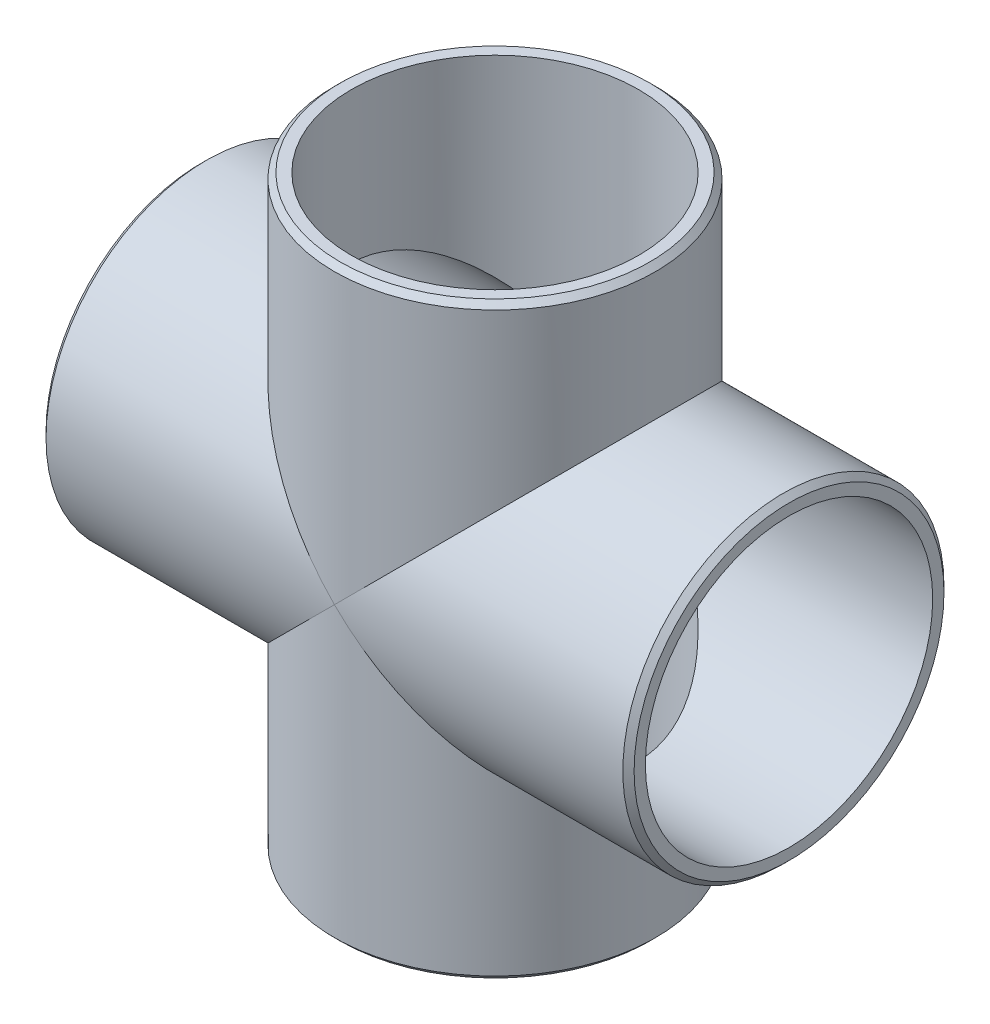
ISO-10303-21;
HEADER;
FILE_DESCRIPTION(('STEP AP214'),'2;1');
FILE_NAME('part.step','',(''),(''),'','','');
FILE_SCHEMA(('AUTOMOTIVE_DESIGN { 1 0 10303 214 1 1 1 1 }'));
ENDSEC;
DATA;
#1=APPLICATION_CONTEXT('core data for automotive mechanical design processes');
#2=APPLICATION_PROTOCOL_DEFINITION('international standard','automotive_design',2000,#1);
#3=PRODUCT_CONTEXT('',#1,'mechanical');
#4=PRODUCT('Part','Part','',(#3));
#5=PRODUCT_RELATED_PRODUCT_CATEGORY('part','',(#4));
#6=PRODUCT_DEFINITION_FORMATION('','',#4);
#7=PRODUCT_DEFINITION_CONTEXT('part definition',#1,'design');
#8=PRODUCT_DEFINITION('design','',#6,#7);
#9=PRODUCT_DEFINITION_SHAPE('','',#8);
#10=(LENGTH_UNIT() NAMED_UNIT(*) SI_UNIT(.MILLI.,.METRE.));
#11=(NAMED_UNIT(*) PLANE_ANGLE_UNIT() SI_UNIT($,.RADIAN.));
#12=(NAMED_UNIT(*) SI_UNIT($,.STERADIAN.) SOLID_ANGLE_UNIT());
#13=UNCERTAINTY_MEASURE_WITH_UNIT(LENGTH_MEASURE(1.E-05),#10,'distance_accuracy_value','');
#14=(GEOMETRIC_REPRESENTATION_CONTEXT(3) GLOBAL_UNCERTAINTY_ASSIGNED_CONTEXT((#13)) GLOBAL_UNIT_ASSIGNED_CONTEXT((#10,
#11,#12)) REPRESENTATION_CONTEXT('',''));
#15=CARTESIAN_POINT('',(0.,0.,0.));
#16=DIRECTION('',(0.,0.,1.));
#17=DIRECTION('',(1.,0.,0.));
#18=AXIS2_PLACEMENT_3D('',#15,#16,#17);
#19=CARTESIAN_POINT('',(-104.648,0.,0.));
#20=DIRECTION('',(-1.,0.,0.));
#21=DIRECTION('',(0.,0.,-1.));
#22=AXIS2_PLACEMENT_3D('',#19,#20,#21);
#23=PLANE('',#22);
#24=CARTESIAN_POINT('',(-104.648,0.,0.));
#25=DIRECTION('',(-1.,0.,0.));
#26=DIRECTION('',(0.,0.,1.));
#27=AXIS2_PLACEMENT_3D('',#24,#25,#26);
#28=CIRCLE('',#27,55.1434);
#29=CARTESIAN_POINT('',(-104.648,0.,55.1434));
#30=VERTEX_POINT('',#29);
#31=EDGE_CURVE('E109',#30,#30,#28,.T.);
#32=ORIENTED_EDGE('',*,*,#31,.T.);
#33=EDGE_LOOP('',(#32));
#34=FACE_BOUND('',#33,.T.);
#35=CARTESIAN_POINT('',(-104.648,0.,0.));
#36=DIRECTION('',(-1.,0.,0.));
#37=DIRECTION('',(0.,0.,1.));
#38=AXIS2_PLACEMENT_3D('',#35,#36,#37);
#39=CIRCLE('',#38,51.1302);
#40=CARTESIAN_POINT('',(-104.648,0.,51.1302));
#41=VERTEX_POINT('',#40);
#42=EDGE_CURVE('E92',#41,#41,#39,.F.);
#43=ORIENTED_EDGE('',*,*,#42,.T.);
#44=EDGE_LOOP('',(#43));
#45=FACE_BOUND('',#44,.T.);
#46=ADVANCED_FACE('F38',(#34,#45),#23,.T.);
#47=CARTESIAN_POINT('',(0.,-104.648,0.));
#48=DIRECTION('',(0.,-1.,0.));
#49=DIRECTION('',(0.,0.,1.));
#50=AXIS2_PLACEMENT_3D('',#47,#48,#49);
#51=PLANE('',#50);
#52=CARTESIAN_POINT('',(0.,-104.648,0.));
#53=DIRECTION('',(0.,-1.,0.));
#54=DIRECTION('',(0.,0.,-1.));
#55=AXIS2_PLACEMENT_3D('',#52,#53,#54);
#56=CIRCLE('',#55,55.1434);
#57=CARTESIAN_POINT('',(0.,-104.648,-55.1434));
#58=VERTEX_POINT('',#57);
#59=EDGE_CURVE('E115',#58,#58,#56,.T.);
#60=ORIENTED_EDGE('',*,*,#59,.T.);
#61=EDGE_LOOP('',(#60));
#62=FACE_BOUND('',#61,.T.);
#63=CARTESIAN_POINT('',(0.,-104.648,0.));
#64=DIRECTION('',(0.,-1.,0.));
#65=DIRECTION('',(0.,0.,-1.));
#66=AXIS2_PLACEMENT_3D('',#63,#64,#65);
#67=CIRCLE('',#66,51.1302);
#68=CARTESIAN_POINT('',(0.,-104.648,-51.1302));
#69=VERTEX_POINT('',#68);
#70=EDGE_CURVE('E85',#69,#69,#67,.F.);
#71=ORIENTED_EDGE('',*,*,#70,.T.);
#72=EDGE_LOOP('',(#71));
#73=FACE_BOUND('',#72,.T.);
#74=ADVANCED_FACE('F139',(#62,#73),#51,.T.);
#75=CARTESIAN_POINT('',(104.648,0.,0.));
#76=DIRECTION('',(-1.,0.,0.));
#77=DIRECTION('',(0.,0.,1.));
#78=AXIS2_PLACEMENT_3D('',#75,#76,#77);
#79=CYLINDRICAL_SURFACE('',#78,57.15);
#80=CARTESIAN_POINT('',(-102.6414,0.,0.));
#81=DIRECTION('',(-1.,0.,0.));
#82=DIRECTION('',(0.,0.,1.));
#83=AXIS2_PLACEMENT_3D('',#80,#81,#82);
#84=CIRCLE('',#83,57.15);
#85=CARTESIAN_POINT('',(-102.6414,0.,57.15));
#86=VERTEX_POINT('',#85);
#87=EDGE_CURVE('E106',#86,#86,#84,.F.);
#88=ORIENTED_EDGE('',*,*,#87,.T.);
#89=EDGE_LOOP('',(#88));
#90=FACE_BOUND('',#89,.T.);
#91=CARTESIAN_POINT('',(0.,0.,0.));
#92=DIRECTION('',(0.707106781186547,-0.707106781186547,0.));
#93=DIRECTION('',(-0.707106781186547,-0.707106781186547,0.));
#94=AXIS2_PLACEMENT_3D('',#91,#92,#93);
#95=ELLIPSE('',#94,80.8223050896224,57.15);
#96=CARTESIAN_POINT('',(0.,0.,-57.15));
#97=VERTEX_POINT('',#96);
#98=CARTESIAN_POINT('',(0.,0.,57.15));
#99=VERTEX_POINT('',#98);
#100=EDGE_CURVE('E100',#97,#99,#95,.F.);
#101=ORIENTED_EDGE('',*,*,#100,.T.);
#102=CARTESIAN_POINT('',(0.,0.,0.));
#103=DIRECTION('',(-0.707106781186547,-0.707106781186547,0.));
#104=DIRECTION('',(-0.707106781186547,0.707106781186547,0.));
#105=AXIS2_PLACEMENT_3D('',#102,#103,#104);
#106=ELLIPSE('',#105,80.8223050896224,57.15);
#107=EDGE_CURVE('E58',#97,#99,#106,.F.);
#108=ORIENTED_EDGE('',*,*,#107,.F.);
#109=EDGE_LOOP('',(#101,#108));
#110=FACE_BOUND('',#109,.T.);
#111=ADVANCED_FACE('F145',(#90,#110),#79,.T.);
#112=CARTESIAN_POINT('',(102.6414,0.,0.));
#113=DIRECTION('',(1.,0.,0.));
#114=DIRECTION('',(0.,0.,-1.));
#115=AXIS2_PLACEMENT_3D('',#112,#113,#114);
#116=CIRCLE('',#115,57.15);
#117=CARTESIAN_POINT('',(102.6414,0.,-57.15));
#118=VERTEX_POINT('',#117);
#119=EDGE_CURVE('E121',#118,#118,#116,.F.);
#120=ORIENTED_EDGE('',*,*,#119,.T.);
#121=EDGE_LOOP('',(#120));
#122=FACE_BOUND('',#121,.T.);
#123=CARTESIAN_POINT('',(0.,0.,0.));
#124=DIRECTION('',(0.707106781186547,0.707106781186547,0.));
#125=DIRECTION('',(-0.707106781186547,0.707106781186547,0.));
#126=AXIS2_PLACEMENT_3D('',#123,#124,#125);
#127=ELLIPSE('',#126,80.8223050896224,57.15);
#128=EDGE_CURVE('E52',#99,#97,#127,.T.);
#129=ORIENTED_EDGE('',*,*,#128,.T.);
#130=CARTESIAN_POINT('',(0.,0.,0.));
#131=DIRECTION('',(-0.707106781186547,0.707106781186547,0.));
#132=DIRECTION('',(-0.707106781186547,-0.707106781186547,0.));
#133=AXIS2_PLACEMENT_3D('',#130,#131,#132);
#134=ELLIPSE('',#133,80.8223050896224,57.15);
#135=EDGE_CURVE('E103',#99,#97,#134,.T.);
#136=ORIENTED_EDGE('',*,*,#135,.F.);
#137=EDGE_LOOP('',(#129,#136));
#138=FACE_BOUND('',#137,.T.);
#139=ADVANCED_FACE('F156',(#122,#138),#79,.T.);
#140=CARTESIAN_POINT('',(104.648,0.,0.));
#141=DIRECTION('',(1.,0.,0.));
#142=DIRECTION('',(0.,0.,-1.));
#143=AXIS2_PLACEMENT_3D('',#140,#141,#142);
#144=PLANE('',#143);
#145=CARTESIAN_POINT('',(104.648,0.,0.));
#146=DIRECTION('',(1.,0.,0.));
#147=DIRECTION('',(0.,0.,-1.));
#148=AXIS2_PLACEMENT_3D('',#145,#146,#147);
#149=CIRCLE('',#148,55.1434);
#150=CARTESIAN_POINT('',(104.648,0.,-55.1434));
#151=VERTEX_POINT('',#150);
#152=EDGE_CURVE('E118',#151,#151,#149,.T.);
#153=ORIENTED_EDGE('',*,*,#152,.T.);
#154=EDGE_LOOP('',(#153));
#155=FACE_BOUND('',#154,.T.);
#156=CARTESIAN_POINT('',(104.648,0.,0.));
#157=DIRECTION('',(1.,0.,0.));
#158=DIRECTION('',(0.,0.,-1.));
#159=AXIS2_PLACEMENT_3D('',#156,#157,#158);
#160=CIRCLE('',#159,51.1302);
#161=CARTESIAN_POINT('',(104.648,0.,-51.1302));
#162=VERTEX_POINT('',#161);
#163=EDGE_CURVE('E79',#162,#162,#160,.T.);
#164=ORIENTED_EDGE('',*,*,#163,.F.);
#165=EDGE_LOOP('',(#164));
#166=FACE_BOUND('',#165,.T.);
#167=ADVANCED_FACE('F153',(#155,#166),#144,.T.);
#168=CARTESIAN_POINT('',(0.,104.648,0.));
#169=DIRECTION('',(0.,-1.,0.));
#170=DIRECTION('',(0.,0.,-1.));
#171=AXIS2_PLACEMENT_3D('',#168,#169,#170);
#172=CYLINDRICAL_SURFACE('',#171,57.15);
#173=CARTESIAN_POINT('',(0.,102.6414,0.));
#174=DIRECTION('',(0.,1.,0.));
#175=DIRECTION('',(0.,0.,1.));
#176=AXIS2_PLACEMENT_3D('',#173,#174,#175);
#177=CIRCLE('',#176,57.15);
#178=CARTESIAN_POINT('',(0.,102.6414,57.15));
#179=VERTEX_POINT('',#178);
#180=EDGE_CURVE('E11',#179,#179,#177,.F.);
#181=ORIENTED_EDGE('',*,*,#180,.T.);
#182=EDGE_LOOP('',(#181));
#183=FACE_BOUND('',#182,.T.);
#184=ORIENTED_EDGE('',*,*,#135,.T.);
#185=ORIENTED_EDGE('',*,*,#107,.T.);
#186=EDGE_LOOP('',(#184,#185));
#187=FACE_BOUND('',#186,.T.);
#188=ADVANCED_FACE('F151',(#183,#187),#172,.T.);
#189=CARTESIAN_POINT('',(0.,104.648,0.));
#190=DIRECTION('',(0.,1.,0.));
#191=DIRECTION('',(0.,0.,1.));
#192=AXIS2_PLACEMENT_3D('',#189,#190,#191);
#193=PLANE('',#192);
#194=CARTESIAN_POINT('',(0.,104.648,0.));
#195=DIRECTION('',(0.,1.,0.));
#196=DIRECTION('',(0.,0.,1.));
#197=AXIS2_PLACEMENT_3D('',#194,#195,#196);
#198=CIRCLE('',#197,55.1434);
#199=CARTESIAN_POINT('',(0.,104.648,55.1434));
#200=VERTEX_POINT('',#199);
#201=EDGE_CURVE('E46',#200,#200,#198,.T.);
#202=ORIENTED_EDGE('',*,*,#201,.T.);
#203=EDGE_LOOP('',(#202));
#204=FACE_BOUND('',#203,.T.);
#205=CARTESIAN_POINT('',(0.,104.648,0.));
#206=DIRECTION('',(0.,1.,0.));
#207=DIRECTION('',(0.,0.,1.));
#208=AXIS2_PLACEMENT_3D('',#205,#206,#207);
#209=CIRCLE('',#208,51.1302);
#210=CARTESIAN_POINT('',(0.,104.648,51.1302));
#211=VERTEX_POINT('',#210);
#212=EDGE_CURVE('E84',#211,#211,#209,.T.);
#213=ORIENTED_EDGE('',*,*,#212,.F.);
#214=EDGE_LOOP('',(#213));
#215=FACE_BOUND('',#214,.T.);
#216=ADVANCED_FACE('F126',(#204,#215),#193,.T.);
#217=CARTESIAN_POINT('',(0.,-104.648,0.));
#218=DIRECTION('',(0.,1.,0.));
#219=DIRECTION('',(0.,0.,-1.));
#220=AXIS2_PLACEMENT_3D('',#217,#218,#219);
#221=CYLINDRICAL_SURFACE('',#220,57.15);
#222=CARTESIAN_POINT('',(0.,-102.6414,0.));
#223=DIRECTION('',(0.,-1.,0.));
#224=DIRECTION('',(0.,0.,-1.));
#225=AXIS2_PLACEMENT_3D('',#222,#223,#224);
#226=CIRCLE('',#225,57.15);
#227=CARTESIAN_POINT('',(0.,-102.6414,-57.15));
#228=VERTEX_POINT('',#227);
#229=EDGE_CURVE('E112',#228,#228,#226,.F.);
#230=ORIENTED_EDGE('',*,*,#229,.T.);
#231=EDGE_LOOP('',(#230));
#232=FACE_BOUND('',#231,.T.);
#233=ORIENTED_EDGE('',*,*,#128,.F.);
#234=ORIENTED_EDGE('',*,*,#100,.F.);
#235=EDGE_LOOP('',(#233,#234));
#236=FACE_BOUND('',#235,.T.);
#237=ADVANCED_FACE('F173',(#232,#236),#221,.T.);
#238=CARTESIAN_POINT('',(104.648,0.,0.));
#239=DIRECTION('',(-1.,0.,0.));
#240=DIRECTION('',(0.,0.,1.));
#241=AXIS2_PLACEMENT_3D('',#238,#239,#240);
#242=CYLINDRICAL_SURFACE('',#241,51.1302);
#243=ORIENTED_EDGE('',*,*,#42,.F.);
#244=EDGE_LOOP('',(#243));
#245=FACE_BOUND('',#244,.T.);
#246=CARTESIAN_POINT('',(0.,0.,0.));
#247=DIRECTION('',(-0.707106781186547,0.707106781186547,0.));
#248=DIRECTION('',(0.707106781186547,0.707106781186547,0.));
#249=AXIS2_PLACEMENT_3D('',#246,#247,#248);
#250=ELLIPSE('',#249,72.3090222868488,51.1302);
#251=CARTESIAN_POINT('',(0.,0.,-51.1302));
#252=VERTEX_POINT('',#251);
#253=CARTESIAN_POINT('',(0.,0.,51.1302));
#254=VERTEX_POINT('',#253);
#255=EDGE_CURVE('E71',#252,#254,#250,.T.);
#256=ORIENTED_EDGE('',*,*,#255,.F.);
#257=CARTESIAN_POINT('',(0.,0.,0.));
#258=DIRECTION('',(-0.707106781186547,-0.707106781186547,0.));
#259=DIRECTION('',(-0.707106781186547,0.707106781186547,0.));
#260=AXIS2_PLACEMENT_3D('',#257,#258,#259);
#261=ELLIPSE('',#260,72.3090222868488,51.1302);
#262=EDGE_CURVE('E67',#252,#254,#261,.F.);
#263=ORIENTED_EDGE('',*,*,#262,.T.);
#264=EDGE_LOOP('',(#256,#263));
#265=FACE_BOUND('',#264,.T.);
#266=ADVANCED_FACE('F69',(#245,#265),#242,.F.);
#267=ORIENTED_EDGE('',*,*,#163,.T.);
#268=EDGE_LOOP('',(#267));
#269=FACE_BOUND('',#268,.T.);
#270=CARTESIAN_POINT('',(0.,0.,0.));
#271=DIRECTION('',(0.707106781186547,0.707106781186547,0.));
#272=DIRECTION('',(-0.707106781186547,0.707106781186547,0.));
#273=AXIS2_PLACEMENT_3D('',#270,#271,#272);
#274=ELLIPSE('',#273,72.3090222868488,51.1302);
#275=EDGE_CURVE('E83',#254,#252,#274,.T.);
#276=ORIENTED_EDGE('',*,*,#275,.F.);
#277=CARTESIAN_POINT('',(0.,0.,0.));
#278=DIRECTION('',(-0.707106781186547,0.707106781186547,0.));
#279=DIRECTION('',(-0.707106781186547,-0.707106781186547,0.));
#280=AXIS2_PLACEMENT_3D('',#277,#278,#279);
#281=ELLIPSE('',#280,72.3090222868488,51.1302);
#282=EDGE_CURVE('E74',#254,#252,#281,.T.);
#283=ORIENTED_EDGE('',*,*,#282,.T.);
#284=EDGE_LOOP('',(#276,#283));
#285=FACE_BOUND('',#284,.T.);
#286=ADVANCED_FACE('F87',(#269,#285),#242,.F.);
#287=CARTESIAN_POINT('',(0.,104.648,0.));
#288=DIRECTION('',(0.,-1.,0.));
#289=DIRECTION('',(0.,0.,-1.));
#290=AXIS2_PLACEMENT_3D('',#287,#288,#289);
#291=CYLINDRICAL_SURFACE('',#290,51.1302);
#292=ORIENTED_EDGE('',*,*,#212,.T.);
#293=EDGE_LOOP('',(#292));
#294=FACE_BOUND('',#293,.T.);
#295=ORIENTED_EDGE('',*,*,#282,.F.);
#296=ORIENTED_EDGE('',*,*,#262,.F.);
#297=EDGE_LOOP('',(#295,#296));
#298=FACE_BOUND('',#297,.T.);
#299=ADVANCED_FACE('F76',(#294,#298),#291,.F.);
#300=CARTESIAN_POINT('',(0.,-104.648,0.));
#301=DIRECTION('',(0.,1.,0.));
#302=DIRECTION('',(0.,0.,-1.));
#303=AXIS2_PLACEMENT_3D('',#300,#301,#302);
#304=CYLINDRICAL_SURFACE('',#303,51.1302);
#305=ORIENTED_EDGE('',*,*,#70,.F.);
#306=EDGE_LOOP('',(#305));
#307=FACE_BOUND('',#306,.T.);
#308=ORIENTED_EDGE('',*,*,#275,.T.);
#309=ORIENTED_EDGE('',*,*,#255,.T.);
#310=EDGE_LOOP('',(#308,#309));
#311=FACE_BOUND('',#310,.T.);
#312=ADVANCED_FACE('F82',(#307,#311),#304,.F.);
#313=CARTESIAN_POINT('',(-102.6414,0.,0.));
#314=DIRECTION('',(1.,0.,0.));
#315=DIRECTION('',(0.,0.,-1.));
#316=AXIS2_PLACEMENT_3D('',#313,#314,#315);
#317=CONICAL_SURFACE('',#316,57.15,0.785398163397438);
#318=ORIENTED_EDGE('',*,*,#31,.F.);
#319=EDGE_LOOP('',(#318));
#320=FACE_BOUND('',#319,.T.);
#321=ORIENTED_EDGE('',*,*,#87,.F.);
#322=EDGE_LOOP('',(#321));
#323=FACE_BOUND('',#322,.T.);
#324=ADVANCED_FACE('F161',(#320,#323),#317,.T.);
#325=CARTESIAN_POINT('',(0.,-102.6414,0.));
#326=DIRECTION('',(0.,1.,0.));
#327=DIRECTION('',(0.,0.,1.));
#328=AXIS2_PLACEMENT_3D('',#325,#326,#327);
#329=CONICAL_SURFACE('',#328,57.15,0.785398163397441);
#330=ORIENTED_EDGE('',*,*,#59,.F.);
#331=EDGE_LOOP('',(#330));
#332=FACE_BOUND('',#331,.T.);
#333=ORIENTED_EDGE('',*,*,#229,.F.);
#334=EDGE_LOOP('',(#333));
#335=FACE_BOUND('',#334,.T.);
#336=ADVANCED_FACE('F135',(#332,#335),#329,.T.);
#337=CARTESIAN_POINT('',(104.648,0.,0.));
#338=DIRECTION('',(-1.,0.,0.));
#339=DIRECTION('',(0.,0.,1.));
#340=AXIS2_PLACEMENT_3D('',#337,#338,#339);
#341=CONICAL_SURFACE('',#340,55.1434,0.785398163397453);
#342=ORIENTED_EDGE('',*,*,#119,.F.);
#343=EDGE_LOOP('',(#342));
#344=FACE_BOUND('',#343,.T.);
#345=ORIENTED_EDGE('',*,*,#152,.F.);
#346=EDGE_LOOP('',(#345));
#347=FACE_BOUND('',#346,.T.);
#348=ADVANCED_FACE('F130',(#344,#347),#341,.T.);
#349=CARTESIAN_POINT('',(0.,104.648,0.));
#350=DIRECTION('',(0.,-1.,0.));
#351=DIRECTION('',(0.,0.,-1.));
#352=AXIS2_PLACEMENT_3D('',#349,#350,#351);
#353=CONICAL_SURFACE('',#352,55.1434,0.785398163397453);
#354=ORIENTED_EDGE('',*,*,#180,.F.);
#355=EDGE_LOOP('',(#354));
#356=FACE_BOUND('',#355,.T.);
#357=ORIENTED_EDGE('',*,*,#201,.F.);
#358=EDGE_LOOP('',(#357));
#359=FACE_BOUND('',#358,.T.);
#360=ADVANCED_FACE('F40',(#356,#359),#353,.T.);
#361=CLOSED_SHELL('',(#46,#74,#111,#139,#167,#188,#216,#237,#266,#286,#299,#312,#324,#336,#348,#360));
#362=MANIFOLD_SOLID_BREP('B2',#361);
#363=ADVANCED_BREP_SHAPE_REPRESENTATION('',(#18,#362),#14);
#364=SHAPE_DEFINITION_REPRESENTATION(#9,#363);
ENDSEC;
END-ISO-10303-21;
